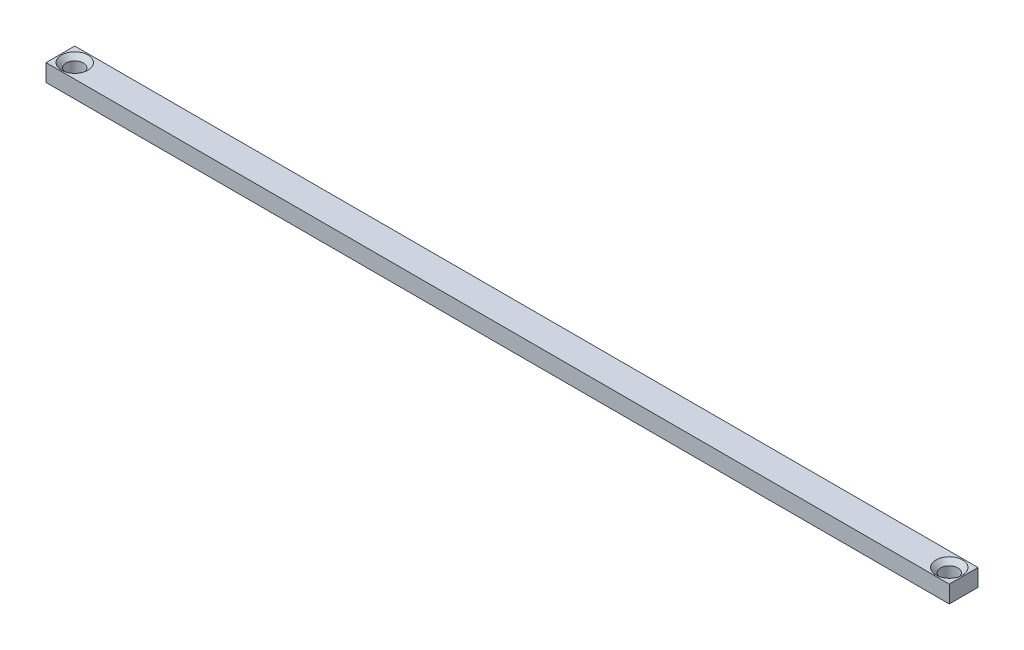
ISO-10303-21;
HEADER;
FILE_DESCRIPTION(('STEP AP214'),'2;1');
FILE_NAME('part.step','',(''),(''),'','','');
FILE_SCHEMA(('AUTOMOTIVE_DESIGN { 1 0 10303 214 1 1 1 1 }'));
ENDSEC;
DATA;
#1=APPLICATION_CONTEXT('core data for automotive mechanical design processes');
#2=APPLICATION_PROTOCOL_DEFINITION('international standard','automotive_design',2000,#1);
#3=PRODUCT_CONTEXT('',#1,'mechanical');
#4=PRODUCT('Part','Part','',(#3));
#5=PRODUCT_RELATED_PRODUCT_CATEGORY('part','',(#4));
#6=PRODUCT_DEFINITION_FORMATION('','',#4);
#7=PRODUCT_DEFINITION_CONTEXT('part definition',#1,'design');
#8=PRODUCT_DEFINITION('design','',#6,#7);
#9=PRODUCT_DEFINITION_SHAPE('','',#8);
#10=(LENGTH_UNIT() NAMED_UNIT(*) SI_UNIT(.MILLI.,.METRE.));
#11=(NAMED_UNIT(*) PLANE_ANGLE_UNIT() SI_UNIT($,.RADIAN.));
#12=(NAMED_UNIT(*) SI_UNIT($,.STERADIAN.) SOLID_ANGLE_UNIT());
#13=UNCERTAINTY_MEASURE_WITH_UNIT(LENGTH_MEASURE(1.E-05),#10,'distance_accuracy_value','');
#14=(GEOMETRIC_REPRESENTATION_CONTEXT(3) GLOBAL_UNCERTAINTY_ASSIGNED_CONTEXT((#13)) GLOBAL_UNIT_ASSIGNED_CONTEXT((#10,
#11,#12)) REPRESENTATION_CONTEXT('',''));
#15=CARTESIAN_POINT('',(0.,0.,0.));
#16=DIRECTION('',(0.,0.,1.));
#17=DIRECTION('',(1.,0.,0.));
#18=AXIS2_PLACEMENT_3D('',#15,#16,#17);
#19=CARTESIAN_POINT('',(0.,3.,0.));
#20=DIRECTION('',(0.,1.,0.));
#21=DIRECTION('',(0.,0.,1.));
#22=AXIS2_PLACEMENT_3D('',#19,#20,#21);
#23=PLANE('',#22);
#24=CARTESIAN_POINT('',(13.1614161562056,3.,-2.81760228438926));
#25=DIRECTION('',(0.,1.,0.));
#26=DIRECTION('',(0.,0.,1.));
#27=AXIS2_PLACEMENT_3D('',#24,#25,#26);
#28=CIRCLE('',#27,2.3);
#29=CARTESIAN_POINT('',(13.1614161562056,3.,-0.517602284389261));
#30=VERTEX_POINT('',#29);
#31=EDGE_CURVE('E52',#30,#30,#28,.F.);
#32=ORIENTED_EDGE('',*,*,#31,.T.);
#33=EDGE_LOOP('',(#32));
#34=FACE_BOUND('',#33,.T.);
#35=CARTESIAN_POINT('',(-139.058583843794,3.,-2.81760228438926));
#36=DIRECTION('',(0.,1.,0.));
#37=DIRECTION('',(0.,0.,1.));
#38=AXIS2_PLACEMENT_3D('',#35,#36,#37);
#39=CIRCLE('',#38,2.3);
#40=CARTESIAN_POINT('',(-139.058583843794,3.,-0.517602284389261));
#41=VERTEX_POINT('',#40);
#42=EDGE_CURVE('E135',#41,#41,#39,.F.);
#43=ORIENTED_EDGE('',*,*,#42,.T.);
#44=EDGE_LOOP('',(#43));
#45=FACE_BOUND('',#44,.T.);
#46=DIRECTION('',(0.,0.,-1.));
#47=VECTOR('',#46,1.);
#48=CARTESIAN_POINT('',(15.6614161562056,3.,-5.31760228438926));
#49=LINE('',#48,#47);
#50=CARTESIAN_POINT('',(15.6614161562056,3.,-0.317602284389258));
#51=VERTEX_POINT('',#50);
#52=CARTESIAN_POINT('',(15.6614161562056,3.,-5.31760228438926));
#53=VERTEX_POINT('',#52);
#54=EDGE_CURVE('E95',#51,#53,#49,.T.);
#55=ORIENTED_EDGE('',*,*,#54,.T.);
#56=DIRECTION('',(-1.,0.,0.));
#57=VECTOR('',#56,1.);
#58=CARTESIAN_POINT('',(-141.558583843794,3.,-5.31760228438926));
#59=LINE('',#58,#57);
#60=CARTESIAN_POINT('',(-141.558583843794,3.,-5.31760228438926));
#61=VERTEX_POINT('',#60);
#62=EDGE_CURVE('E91',#53,#61,#59,.T.);
#63=ORIENTED_EDGE('',*,*,#62,.T.);
#64=DIRECTION('',(0.,0.,1.));
#65=VECTOR('',#64,1.);
#66=CARTESIAN_POINT('',(-141.558583843794,3.,-5.31760228438926));
#67=LINE('',#66,#65);
#68=CARTESIAN_POINT('',(-141.558583843794,3.,-0.317602284389258));
#69=VERTEX_POINT('',#68);
#70=EDGE_CURVE('E93',#61,#69,#67,.T.);
#71=ORIENTED_EDGE('',*,*,#70,.T.);
#72=DIRECTION('',(1.,0.,0.));
#73=VECTOR('',#72,1.);
#74=CARTESIAN_POINT('',(-141.558583843794,3.,-0.317602284389258));
#75=LINE('',#74,#73);
#76=EDGE_CURVE('E60',#69,#51,#75,.T.);
#77=ORIENTED_EDGE('',*,*,#76,.T.);
#78=EDGE_LOOP('',(#55,#63,#71,#77));
#79=FACE_BOUND('',#78,.T.);
#80=ADVANCED_FACE('F41',(#34,#45,#79),#23,.T.);
#81=CARTESIAN_POINT('',(0.,0.,0.));
#82=DIRECTION('',(0.,1.,0.));
#83=DIRECTION('',(0.,0.,1.));
#84=AXIS2_PLACEMENT_3D('',#81,#82,#83);
#85=PLANE('',#84);
#86=DIRECTION('',(0.,0.,-1.));
#87=VECTOR('',#86,1.);
#88=CARTESIAN_POINT('',(15.6614161562056,0.,-5.31760228438926));
#89=LINE('',#88,#87);
#90=CARTESIAN_POINT('',(15.6614161562056,0.,-0.317602284389258));
#91=VERTEX_POINT('',#90);
#92=CARTESIAN_POINT('',(15.6614161562056,0.,-5.31760228438926));
#93=VERTEX_POINT('',#92);
#94=EDGE_CURVE('E114',#91,#93,#89,.T.);
#95=ORIENTED_EDGE('',*,*,#94,.F.);
#96=DIRECTION('',(1.,0.,0.));
#97=VECTOR('',#96,1.);
#98=CARTESIAN_POINT('',(-141.558583843794,0.,-0.317602284389258));
#99=LINE('',#98,#97);
#100=CARTESIAN_POINT('',(-141.558583843794,0.,-0.317602284389258));
#101=VERTEX_POINT('',#100);
#102=EDGE_CURVE('E83',#101,#91,#99,.T.);
#103=ORIENTED_EDGE('',*,*,#102,.F.);
#104=DIRECTION('',(0.,0.,1.));
#105=VECTOR('',#104,1.);
#106=CARTESIAN_POINT('',(-141.558583843794,0.,-5.31760228438926));
#107=LINE('',#106,#105);
#108=CARTESIAN_POINT('',(-141.558583843794,0.,-5.31760228438926));
#109=VERTEX_POINT('',#108);
#110=EDGE_CURVE('E77',#109,#101,#107,.T.);
#111=ORIENTED_EDGE('',*,*,#110,.F.);
#112=DIRECTION('',(-1.,0.,0.));
#113=VECTOR('',#112,1.);
#114=CARTESIAN_POINT('',(-141.558583843794,0.,-5.31760228438926));
#115=LINE('',#114,#113);
#116=EDGE_CURVE('E101',#93,#109,#115,.T.);
#117=ORIENTED_EDGE('',*,*,#116,.F.);
#118=EDGE_LOOP('',(#95,#103,#111,#117));
#119=FACE_BOUND('',#118,.T.);
#120=CARTESIAN_POINT('',(13.1614161562056,0.,-2.81760228438926));
#121=DIRECTION('',(0.,1.,0.));
#122=DIRECTION('',(0.,0.,1.));
#123=AXIS2_PLACEMENT_3D('',#120,#121,#122);
#124=CIRCLE('',#123,1.5);
#125=CARTESIAN_POINT('',(13.1614161562056,0.,-1.31760228438926));
#126=VERTEX_POINT('',#125);
#127=EDGE_CURVE('E118',#126,#126,#124,.T.);
#128=ORIENTED_EDGE('',*,*,#127,.T.);
#129=EDGE_LOOP('',(#128));
#130=FACE_BOUND('',#129,.T.);
#131=CARTESIAN_POINT('',(-139.058583843794,0.,-2.81760228438926));
#132=DIRECTION('',(0.,1.,0.));
#133=DIRECTION('',(0.,0.,1.));
#134=AXIS2_PLACEMENT_3D('',#131,#132,#133);
#135=CIRCLE('',#134,1.5);
#136=CARTESIAN_POINT('',(-139.058583843794,0.,-1.31760228438926));
#137=VERTEX_POINT('',#136);
#138=EDGE_CURVE('E159',#137,#137,#135,.T.);
#139=ORIENTED_EDGE('',*,*,#138,.T.);
#140=EDGE_LOOP('',(#139));
#141=FACE_BOUND('',#140,.T.);
#142=ADVANCED_FACE('F167',(#119,#130,#141),#85,.F.);
#143=CARTESIAN_POINT('',(15.6614161562056,3.,-5.31760228438926));
#144=DIRECTION('',(-1.,0.,0.));
#145=DIRECTION('',(0.,0.,1.));
#146=AXIS2_PLACEMENT_3D('',#143,#144,#145);
#147=PLANE('',#146);
#148=ORIENTED_EDGE('',*,*,#94,.T.);
#149=DIRECTION('',(0.,-1.,0.));
#150=VECTOR('',#149,1.);
#151=CARTESIAN_POINT('',(15.6614161562056,3.,-5.31760228438926));
#152=LINE('',#151,#150);
#153=EDGE_CURVE('E103',#53,#93,#152,.T.);
#154=ORIENTED_EDGE('',*,*,#153,.F.);
#155=ORIENTED_EDGE('',*,*,#54,.F.);
#156=DIRECTION('',(0.,-1.,0.));
#157=VECTOR('',#156,1.);
#158=CARTESIAN_POINT('',(15.6614161562056,3.,-0.317602284389258));
#159=LINE('',#158,#157);
#160=EDGE_CURVE('E110',#51,#91,#159,.T.);
#161=ORIENTED_EDGE('',*,*,#160,.T.);
#162=EDGE_LOOP('',(#148,#154,#155,#161));
#163=FACE_BOUND('',#162,.T.);
#164=ADVANCED_FACE('F179',(#163),#147,.F.);
#165=CARTESIAN_POINT('',(-141.558583843794,3.,-5.31760228438926));
#166=DIRECTION('',(0.,0.,1.));
#167=DIRECTION('',(1.,0.,0.));
#168=AXIS2_PLACEMENT_3D('',#165,#166,#167);
#169=PLANE('',#168);
#170=ORIENTED_EDGE('',*,*,#116,.T.);
#171=DIRECTION('',(0.,-1.,0.));
#172=VECTOR('',#171,1.);
#173=CARTESIAN_POINT('',(-141.558583843794,3.,-5.31760228438926));
#174=LINE('',#173,#172);
#175=EDGE_CURVE('E99',#61,#109,#174,.T.);
#176=ORIENTED_EDGE('',*,*,#175,.F.);
#177=ORIENTED_EDGE('',*,*,#62,.F.);
#178=ORIENTED_EDGE('',*,*,#153,.T.);
#179=EDGE_LOOP('',(#170,#176,#177,#178));
#180=FACE_BOUND('',#179,.T.);
#181=ADVANCED_FACE('F100',(#180),#169,.F.);
#182=CARTESIAN_POINT('',(-141.558583843794,3.,-5.31760228438926));
#183=DIRECTION('',(1.,0.,0.));
#184=DIRECTION('',(0.,0.,-1.));
#185=AXIS2_PLACEMENT_3D('',#182,#183,#184);
#186=PLANE('',#185);
#187=ORIENTED_EDGE('',*,*,#110,.T.);
#188=DIRECTION('',(0.,-1.,0.));
#189=VECTOR('',#188,1.);
#190=CARTESIAN_POINT('',(-141.558583843794,3.,-0.317602284389258));
#191=LINE('',#190,#189);
#192=EDGE_CURVE('E104',#69,#101,#191,.T.);
#193=ORIENTED_EDGE('',*,*,#192,.F.);
#194=ORIENTED_EDGE('',*,*,#70,.F.);
#195=ORIENTED_EDGE('',*,*,#175,.T.);
#196=EDGE_LOOP('',(#187,#193,#194,#195));
#197=FACE_BOUND('',#196,.T.);
#198=ADVANCED_FACE('F106',(#197),#186,.F.);
#199=CARTESIAN_POINT('',(-141.558583843794,3.,-0.317602284389258));
#200=DIRECTION('',(0.,0.,-1.));
#201=DIRECTION('',(-1.,0.,0.));
#202=AXIS2_PLACEMENT_3D('',#199,#200,#201);
#203=PLANE('',#202);
#204=ORIENTED_EDGE('',*,*,#102,.T.);
#205=ORIENTED_EDGE('',*,*,#160,.F.);
#206=ORIENTED_EDGE('',*,*,#76,.F.);
#207=ORIENTED_EDGE('',*,*,#192,.T.);
#208=EDGE_LOOP('',(#204,#205,#206,#207));
#209=FACE_BOUND('',#208,.T.);
#210=ADVANCED_FACE('F153',(#209),#203,.F.);
#211=CARTESIAN_POINT('',(13.1614161562056,3.,-2.81760228438926));
#212=DIRECTION('',(0.,-1.,0.));
#213=DIRECTION('',(0.,0.,-1.));
#214=AXIS2_PLACEMENT_3D('',#211,#212,#213);
#215=CYLINDRICAL_SURFACE('',#214,1.5);
#216=CARTESIAN_POINT('',(13.1614161562056,2.2,-2.81760228438926));
#217=DIRECTION('',(0.,1.,0.));
#218=DIRECTION('',(0.,0.,1.));
#219=AXIS2_PLACEMENT_3D('',#216,#217,#218);
#220=CIRCLE('',#219,1.5);
#221=CARTESIAN_POINT('',(13.1614161562056,2.2,-1.31760228438926));
#222=VERTEX_POINT('',#221);
#223=EDGE_CURVE('E131',#222,#222,#220,.T.);
#224=ORIENTED_EDGE('',*,*,#223,.T.);
#225=EDGE_LOOP('',(#224));
#226=FACE_BOUND('',#225,.T.);
#227=ORIENTED_EDGE('',*,*,#127,.F.);
#228=EDGE_LOOP('',(#227));
#229=FACE_BOUND('',#228,.T.);
#230=ADVANCED_FACE('F150',(#226,#229),#215,.F.);
#231=CARTESIAN_POINT('',(-139.058583843794,3.,-2.81760228438926));
#232=DIRECTION('',(0.,-1.,0.));
#233=DIRECTION('',(0.,0.,-1.));
#234=AXIS2_PLACEMENT_3D('',#231,#232,#233);
#235=CYLINDRICAL_SURFACE('',#234,1.5);
#236=CARTESIAN_POINT('',(-139.058583843794,2.2,-2.81760228438926));
#237=DIRECTION('',(0.,1.,0.));
#238=DIRECTION('',(0.,0.,1.));
#239=AXIS2_PLACEMENT_3D('',#236,#237,#238);
#240=CIRCLE('',#239,1.5);
#241=CARTESIAN_POINT('',(-139.058583843794,2.2,-1.31760228438926));
#242=VERTEX_POINT('',#241);
#243=EDGE_CURVE('E11',#242,#242,#240,.T.);
#244=ORIENTED_EDGE('',*,*,#243,.T.);
#245=EDGE_LOOP('',(#244));
#246=FACE_BOUND('',#245,.T.);
#247=ORIENTED_EDGE('',*,*,#138,.F.);
#248=EDGE_LOOP('',(#247));
#249=FACE_BOUND('',#248,.T.);
#250=ADVANCED_FACE('F147',(#246,#249),#235,.F.);
#251=CARTESIAN_POINT('',(13.1614161562056,2.2,-2.81760228438926));
#252=DIRECTION('',(0.,1.,0.));
#253=DIRECTION('',(0.,0.,1.));
#254=AXIS2_PLACEMENT_3D('',#251,#252,#253);
#255=CONICAL_SURFACE('',#254,1.5,0.785398163397445);
#256=ORIENTED_EDGE('',*,*,#31,.F.);
#257=EDGE_LOOP('',(#256));
#258=FACE_BOUND('',#257,.T.);
#259=ORIENTED_EDGE('',*,*,#223,.F.);
#260=EDGE_LOOP('',(#259));
#261=FACE_BOUND('',#260,.T.);
#262=ADVANCED_FACE('F144',(#258,#261),#255,.F.);
#263=CARTESIAN_POINT('',(-139.058583843794,2.2,-2.81760228438926));
#264=DIRECTION('',(0.,1.,0.));
#265=DIRECTION('',(0.,0.,1.));
#266=AXIS2_PLACEMENT_3D('',#263,#264,#265);
#267=CONICAL_SURFACE('',#266,1.5,0.785398163397445);
#268=ORIENTED_EDGE('',*,*,#42,.F.);
#269=EDGE_LOOP('',(#268));
#270=FACE_BOUND('',#269,.T.);
#271=ORIENTED_EDGE('',*,*,#243,.F.);
#272=EDGE_LOOP('',(#271));
#273=FACE_BOUND('',#272,.T.);
#274=ADVANCED_FACE('F44',(#270,#273),#267,.F.);
#275=CLOSED_SHELL('',(#80,#142,#164,#181,#198,#210,#230,#250,#262,#274));
#276=MANIFOLD_SOLID_BREP('B2',#275);
#277=ADVANCED_BREP_SHAPE_REPRESENTATION('',(#18,#276),#14);
#278=SHAPE_DEFINITION_REPRESENTATION(#9,#277);
ENDSEC;
END-ISO-10303-21;
